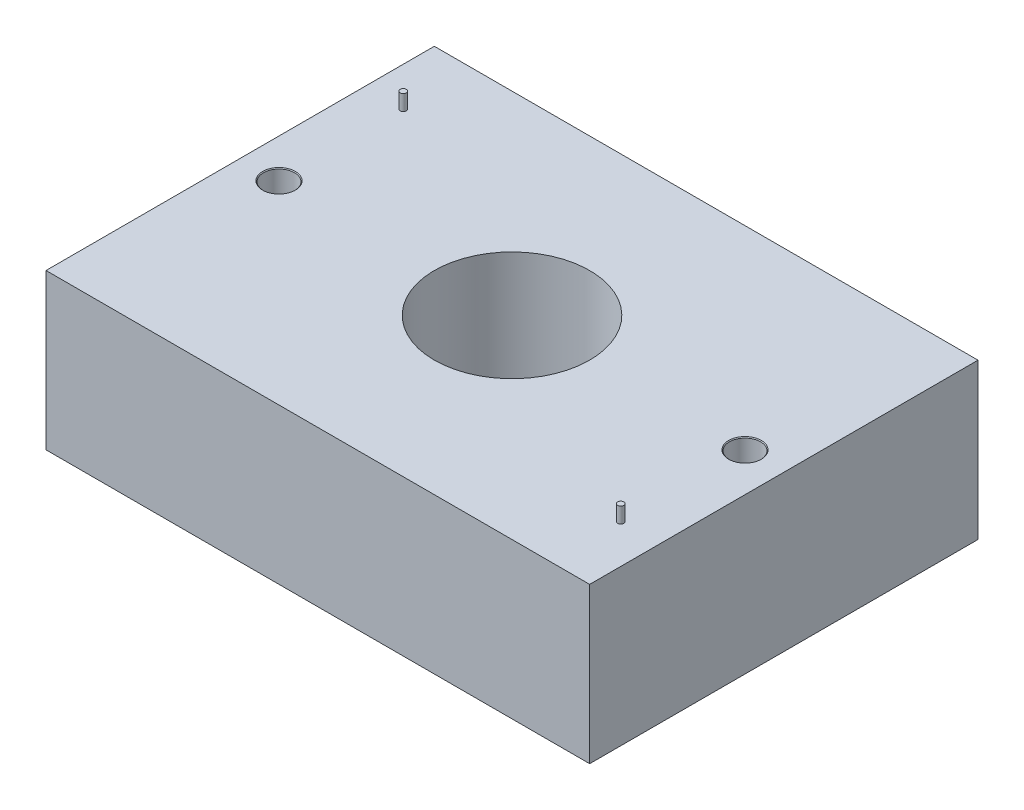
ISO-10303-21;
HEADER;
FILE_DESCRIPTION(('STEP AP214'),'2;1');
FILE_NAME('part.step','',(''),(''),'','','');
FILE_SCHEMA(('AUTOMOTIVE_DESIGN { 1 0 10303 214 1 1 1 1 }'));
ENDSEC;
DATA;
#1=APPLICATION_CONTEXT('core data for automotive mechanical design processes');
#2=APPLICATION_PROTOCOL_DEFINITION('international standard','automotive_design',2000,#1);
#3=PRODUCT_CONTEXT('',#1,'mechanical');
#4=PRODUCT('Part','Part','',(#3));
#5=PRODUCT_RELATED_PRODUCT_CATEGORY('part','',(#4));
#6=PRODUCT_DEFINITION_FORMATION('','',#4);
#7=PRODUCT_DEFINITION_CONTEXT('part definition',#1,'design');
#8=PRODUCT_DEFINITION('design','',#6,#7);
#9=PRODUCT_DEFINITION_SHAPE('','',#8);
#10=(LENGTH_UNIT() NAMED_UNIT(*) SI_UNIT(.MILLI.,.METRE.));
#11=(NAMED_UNIT(*) PLANE_ANGLE_UNIT() SI_UNIT($,.RADIAN.));
#12=(NAMED_UNIT(*) SI_UNIT($,.STERADIAN.) SOLID_ANGLE_UNIT());
#13=UNCERTAINTY_MEASURE_WITH_UNIT(LENGTH_MEASURE(1.E-05),#10,'distance_accuracy_value','');
#14=(GEOMETRIC_REPRESENTATION_CONTEXT(3) GLOBAL_UNCERTAINTY_ASSIGNED_CONTEXT((#13)) GLOBAL_UNIT_ASSIGNED_CONTEXT((#10,
#11,#12)) REPRESENTATION_CONTEXT('',''));
#15=CARTESIAN_POINT('',(0.,0.,0.));
#16=DIRECTION('',(0.,0.,1.));
#17=DIRECTION('',(1.,0.,0.));
#18=AXIS2_PLACEMENT_3D('',#15,#16,#17);
#19=CARTESIAN_POINT('',(0.,-50.,0.));
#20=DIRECTION('',(0.,0.,1.));
#21=DIRECTION('',(1.,0.,0.));
#22=AXIS2_PLACEMENT_3D('',#19,#20,#21);
#23=PLANE('',#22);
#24=DIRECTION('',(1.,0.,0.));
#25=VECTOR('',#24,1.);
#26=CARTESIAN_POINT('',(0.,0.,0.));
#27=LINE('',#26,#25);
#28=CARTESIAN_POINT('',(0.,0.,0.));
#29=VERTEX_POINT('',#28);
#30=CARTESIAN_POINT('',(175.,0.,0.));
#31=VERTEX_POINT('',#30);
#32=EDGE_CURVE('E190',#29,#31,#27,.T.);
#33=ORIENTED_EDGE('',*,*,#32,.F.);
#34=DIRECTION('',(0.,1.,0.));
#35=VECTOR('',#34,1.);
#36=CARTESIAN_POINT('',(0.,-50.,0.));
#37=LINE('',#36,#35);
#38=CARTESIAN_POINT('',(0.,-50.,0.));
#39=VERTEX_POINT('',#38);
#40=EDGE_CURVE('E13',#39,#29,#37,.T.);
#41=ORIENTED_EDGE('',*,*,#40,.F.);
#42=DIRECTION('',(1.,0.,0.));
#43=VECTOR('',#42,1.);
#44=CARTESIAN_POINT('',(0.,-50.,0.));
#45=LINE('',#44,#43);
#46=CARTESIAN_POINT('',(175.,-50.,0.));
#47=VERTEX_POINT('',#46);
#48=EDGE_CURVE('E204',#39,#47,#45,.T.);
#49=ORIENTED_EDGE('',*,*,#48,.T.);
#50=DIRECTION('',(0.,1.,0.));
#51=VECTOR('',#50,1.);
#52=CARTESIAN_POINT('',(175.,-50.,0.));
#53=LINE('',#52,#51);
#54=EDGE_CURVE('E69',#47,#31,#53,.T.);
#55=ORIENTED_EDGE('',*,*,#54,.T.);
#56=EDGE_LOOP('',(#33,#41,#49,#55));
#57=FACE_BOUND('',#56,.T.);
#58=ADVANCED_FACE('F65',(#57),#23,.T.);
#59=CARTESIAN_POINT('',(0.,-50.,0.));
#60=DIRECTION('',(1.,0.,0.));
#61=DIRECTION('',(0.,0.,-1.));
#62=AXIS2_PLACEMENT_3D('',#59,#60,#61);
#63=PLANE('',#62);
#64=DIRECTION('',(0.,0.,-1.));
#65=VECTOR('',#64,1.);
#66=CARTESIAN_POINT('',(0.,0.,0.));
#67=LINE('',#66,#65);
#68=CARTESIAN_POINT('',(0.,0.,-125.));
#69=VERTEX_POINT('',#68);
#70=EDGE_CURVE('E108',#29,#69,#67,.T.);
#71=ORIENTED_EDGE('',*,*,#70,.T.);
#72=DIRECTION('',(0.,1.,0.));
#73=VECTOR('',#72,1.);
#74=CARTESIAN_POINT('',(0.,-50.,-125.));
#75=LINE('',#74,#73);
#76=CARTESIAN_POINT('',(0.,-50.,-125.));
#77=VERTEX_POINT('',#76);
#78=EDGE_CURVE('E77',#77,#69,#75,.T.);
#79=ORIENTED_EDGE('',*,*,#78,.F.);
#80=DIRECTION('',(0.,0.,-1.));
#81=VECTOR('',#80,1.);
#82=CARTESIAN_POINT('',(0.,-50.,0.));
#83=LINE('',#82,#81);
#84=EDGE_CURVE('E183',#39,#77,#83,.T.);
#85=ORIENTED_EDGE('',*,*,#84,.F.);
#86=ORIENTED_EDGE('',*,*,#40,.T.);
#87=EDGE_LOOP('',(#71,#79,#85,#86));
#88=FACE_BOUND('',#87,.T.);
#89=ADVANCED_FACE('F310',(#88),#63,.F.);
#90=CARTESIAN_POINT('',(0.,-50.,-125.));
#91=DIRECTION('',(0.,0.,1.));
#92=DIRECTION('',(1.,0.,0.));
#93=AXIS2_PLACEMENT_3D('',#90,#91,#92);
#94=PLANE('',#93);
#95=DIRECTION('',(1.,0.,0.));
#96=VECTOR('',#95,1.);
#97=CARTESIAN_POINT('',(0.,0.,-125.));
#98=LINE('',#97,#96);
#99=CARTESIAN_POINT('',(175.,0.,-125.));
#100=VERTEX_POINT('',#99);
#101=EDGE_CURVE('E221',#69,#100,#98,.T.);
#102=ORIENTED_EDGE('',*,*,#101,.T.);
#103=DIRECTION('',(0.,1.,0.));
#104=VECTOR('',#103,1.);
#105=CARTESIAN_POINT('',(175.,-50.,-125.));
#106=LINE('',#105,#104);
#107=CARTESIAN_POINT('',(175.,-50.,-125.));
#108=VERTEX_POINT('',#107);
#109=EDGE_CURVE('E167',#108,#100,#106,.T.);
#110=ORIENTED_EDGE('',*,*,#109,.F.);
#111=DIRECTION('',(1.,0.,0.));
#112=VECTOR('',#111,1.);
#113=CARTESIAN_POINT('',(0.,-50.,-125.));
#114=LINE('',#113,#112);
#115=EDGE_CURVE('E180',#77,#108,#114,.T.);
#116=ORIENTED_EDGE('',*,*,#115,.F.);
#117=ORIENTED_EDGE('',*,*,#78,.T.);
#118=EDGE_LOOP('',(#102,#110,#116,#117));
#119=FACE_BOUND('',#118,.T.);
#120=ADVANCED_FACE('F309',(#119),#94,.F.);
#121=CARTESIAN_POINT('',(175.,-50.,0.));
#122=DIRECTION('',(1.,0.,0.));
#123=DIRECTION('',(0.,0.,-1.));
#124=AXIS2_PLACEMENT_3D('',#121,#122,#123);
#125=PLANE('',#124);
#126=DIRECTION('',(0.,0.,-1.));
#127=VECTOR('',#126,1.);
#128=CARTESIAN_POINT('',(175.,0.,0.));
#129=LINE('',#128,#127);
#130=EDGE_CURVE('E195',#31,#100,#129,.T.);
#131=ORIENTED_EDGE('',*,*,#130,.F.);
#132=ORIENTED_EDGE('',*,*,#54,.F.);
#133=DIRECTION('',(0.,0.,-1.));
#134=VECTOR('',#133,1.);
#135=CARTESIAN_POINT('',(175.,-50.,0.));
#136=LINE('',#135,#134);
#137=EDGE_CURVE('E184',#47,#108,#136,.T.);
#138=ORIENTED_EDGE('',*,*,#137,.T.);
#139=ORIENTED_EDGE('',*,*,#109,.T.);
#140=EDGE_LOOP('',(#131,#132,#138,#139));
#141=FACE_BOUND('',#140,.T.);
#142=ADVANCED_FACE('F305',(#141),#125,.T.);
#143=CARTESIAN_POINT('',(0.,-50.,0.));
#144=DIRECTION('',(0.,1.,0.));
#145=DIRECTION('',(0.,0.,1.));
#146=AXIS2_PLACEMENT_3D('',#143,#144,#145);
#147=PLANE('',#146);
#148=CARTESIAN_POINT('',(87.5,-50.,-62.5));
#149=DIRECTION('',(0.,1.,0.));
#150=DIRECTION('',(0.,0.,1.));
#151=AXIS2_PLACEMENT_3D('',#148,#149,#150);
#152=CIRCLE('',#151,25.);
#153=CARTESIAN_POINT('',(87.5,-50.,-37.5));
#154=VERTEX_POINT('',#153);
#155=EDGE_CURVE('E196',#154,#154,#152,.T.);
#156=ORIENTED_EDGE('',*,*,#155,.T.);
#157=EDGE_LOOP('',(#156));
#158=FACE_BOUND('',#157,.T.);
#159=ORIENTED_EDGE('',*,*,#48,.F.);
#160=ORIENTED_EDGE('',*,*,#84,.T.);
#161=ORIENTED_EDGE('',*,*,#115,.T.);
#162=ORIENTED_EDGE('',*,*,#137,.F.);
#163=EDGE_LOOP('',(#159,#160,#161,#162));
#164=FACE_BOUND('',#163,.T.);
#165=ADVANCED_FACE('F292',(#158,#164),#147,.F.);
#166=CARTESIAN_POINT('',(0.,0.,0.));
#167=DIRECTION('',(0.,1.,0.));
#168=DIRECTION('',(0.,0.,1.));
#169=AXIS2_PLACEMENT_3D('',#166,#167,#168);
#170=PLANE('',#169);
#171=CARTESIAN_POINT('',(12.5,0.,-62.5));
#172=DIRECTION('',(0.,1.,0.));
#173=DIRECTION('',(0.,0.,1.));
#174=AXIS2_PLACEMENT_3D('',#171,#172,#173);
#175=CIRCLE('',#174,5.25);
#176=CARTESIAN_POINT('',(12.5,0.,-57.25));
#177=VERTEX_POINT('',#176);
#178=EDGE_CURVE('E274',#177,#177,#175,.T.);
#179=ORIENTED_EDGE('',*,*,#178,.F.);
#180=EDGE_LOOP('',(#179));
#181=FACE_BOUND('',#180,.T.);
#182=CARTESIAN_POINT('',(162.5,0.,-62.5));
#183=DIRECTION('',(0.,1.,0.));
#184=DIRECTION('',(0.,0.,1.));
#185=AXIS2_PLACEMENT_3D('',#182,#183,#184);
#186=CIRCLE('',#185,5.25);
#187=CARTESIAN_POINT('',(162.5,0.,-57.25));
#188=VERTEX_POINT('',#187);
#189=EDGE_CURVE('E139',#188,#188,#186,.T.);
#190=ORIENTED_EDGE('',*,*,#189,.F.);
#191=EDGE_LOOP('',(#190));
#192=FACE_BOUND('',#191,.T.);
#193=CARTESIAN_POINT('',(162.5,0.,-22.5));
#194=DIRECTION('',(0.,1.,0.));
#195=DIRECTION('',(0.,0.,1.));
#196=AXIS2_PLACEMENT_3D('',#193,#194,#195);
#197=CIRCLE('',#196,0.999999999999998);
#198=CARTESIAN_POINT('',(162.5,0.,-21.5));
#199=VERTEX_POINT('',#198);
#200=EDGE_CURVE('E238',#199,#199,#197,.T.);
#201=ORIENTED_EDGE('',*,*,#200,.F.);
#202=EDGE_LOOP('',(#201));
#203=FACE_BOUND('',#202,.T.);
#204=CARTESIAN_POINT('',(12.5,0.,-102.5));
#205=DIRECTION('',(0.,1.,0.));
#206=DIRECTION('',(0.,0.,1.));
#207=AXIS2_PLACEMENT_3D('',#204,#205,#206);
#208=CIRCLE('',#207,1.);
#209=CARTESIAN_POINT('',(12.5,0.,-101.5));
#210=VERTEX_POINT('',#209);
#211=EDGE_CURVE('E235',#210,#210,#208,.T.);
#212=ORIENTED_EDGE('',*,*,#211,.F.);
#213=EDGE_LOOP('',(#212));
#214=FACE_BOUND('',#213,.T.);
#215=CARTESIAN_POINT('',(87.5,0.,-62.5));
#216=DIRECTION('',(0.,1.,0.));
#217=DIRECTION('',(0.,0.,1.));
#218=AXIS2_PLACEMENT_3D('',#215,#216,#217);
#219=CIRCLE('',#218,25.);
#220=CARTESIAN_POINT('',(87.5,0.,-37.5));
#221=VERTEX_POINT('',#220);
#222=EDGE_CURVE('E208',#221,#221,#219,.T.);
#223=ORIENTED_EDGE('',*,*,#222,.F.);
#224=EDGE_LOOP('',(#223));
#225=FACE_BOUND('',#224,.T.);
#226=ORIENTED_EDGE('',*,*,#32,.T.);
#227=ORIENTED_EDGE('',*,*,#130,.T.);
#228=ORIENTED_EDGE('',*,*,#101,.F.);
#229=ORIENTED_EDGE('',*,*,#70,.F.);
#230=EDGE_LOOP('',(#226,#227,#228,#229));
#231=FACE_BOUND('',#230,.T.);
#232=ADVANCED_FACE('F288',(#181,#192,#203,#214,#225,#231),#170,.T.);
#233=CARTESIAN_POINT('',(87.5,-50.,-62.5));
#234=DIRECTION('',(0.,1.,0.));
#235=DIRECTION('',(0.,0.,1.));
#236=AXIS2_PLACEMENT_3D('',#233,#234,#235);
#237=CYLINDRICAL_SURFACE('',#236,25.);
#238=ORIENTED_EDGE('',*,*,#155,.F.);
#239=EDGE_LOOP('',(#238));
#240=FACE_BOUND('',#239,.T.);
#241=ORIENTED_EDGE('',*,*,#222,.T.);
#242=EDGE_LOOP('',(#241));
#243=FACE_BOUND('',#242,.T.);
#244=ADVANCED_FACE('F291',(#240,#243),#237,.F.);
#245=CARTESIAN_POINT('',(12.5,5.,-102.5));
#246=DIRECTION('',(0.,-1.,0.));
#247=DIRECTION('',(0.,0.,-1.));
#248=AXIS2_PLACEMENT_3D('',#245,#246,#247);
#249=CYLINDRICAL_SURFACE('',#248,1.);
#250=CARTESIAN_POINT('',(12.5,5.,-102.5));
#251=DIRECTION('',(0.,1.,0.));
#252=DIRECTION('',(0.,0.,1.));
#253=AXIS2_PLACEMENT_3D('',#250,#251,#252);
#254=CIRCLE('',#253,1.);
#255=CARTESIAN_POINT('',(12.5,5.,-101.5));
#256=VERTEX_POINT('',#255);
#257=EDGE_CURVE('E213',#256,#256,#254,.T.);
#258=ORIENTED_EDGE('',*,*,#257,.F.);
#259=EDGE_LOOP('',(#258));
#260=FACE_BOUND('',#259,.T.);
#261=ORIENTED_EDGE('',*,*,#211,.T.);
#262=EDGE_LOOP('',(#261));
#263=FACE_BOUND('',#262,.T.);
#264=ADVANCED_FACE('F378',(#260,#263),#249,.T.);
#265=CARTESIAN_POINT('',(0.,5.,0.));
#266=DIRECTION('',(0.,1.,0.));
#267=DIRECTION('',(0.,0.,1.));
#268=AXIS2_PLACEMENT_3D('',#265,#266,#267);
#269=PLANE('',#268);
#270=ORIENTED_EDGE('',*,*,#257,.T.);
#271=EDGE_LOOP('',(#270));
#272=FACE_BOUND('',#271,.T.);
#273=ADVANCED_FACE('F370',(#272),#269,.T.);
#274=CARTESIAN_POINT('',(162.5,5.,-22.5));
#275=DIRECTION('',(0.,-1.,0.));
#276=DIRECTION('',(0.,0.,-1.));
#277=AXIS2_PLACEMENT_3D('',#274,#275,#276);
#278=CYLINDRICAL_SURFACE('',#277,0.999999999999998);
#279=CARTESIAN_POINT('',(162.5,5.,-22.5));
#280=DIRECTION('',(0.,1.,0.));
#281=DIRECTION('',(0.,0.,1.));
#282=AXIS2_PLACEMENT_3D('',#279,#280,#281);
#283=CIRCLE('',#282,0.999999999999998);
#284=CARTESIAN_POINT('',(162.5,5.,-21.5));
#285=VERTEX_POINT('',#284);
#286=EDGE_CURVE('E241',#285,#285,#283,.T.);
#287=ORIENTED_EDGE('',*,*,#286,.F.);
#288=EDGE_LOOP('',(#287));
#289=FACE_BOUND('',#288,.T.);
#290=ORIENTED_EDGE('',*,*,#200,.T.);
#291=EDGE_LOOP('',(#290));
#292=FACE_BOUND('',#291,.T.);
#293=ADVANCED_FACE('F367',(#289,#292),#278,.T.);
#294=CARTESIAN_POINT('',(162.5,5.,-22.5));
#295=DIRECTION('',(0.,1.,0.));
#296=DIRECTION('',(0.,0.,1.));
#297=AXIS2_PLACEMENT_3D('',#294,#295,#296);
#298=PLANE('',#297);
#299=ORIENTED_EDGE('',*,*,#286,.T.);
#300=EDGE_LOOP('',(#299));
#301=FACE_BOUND('',#300,.T.);
#302=ADVANCED_FACE('F365',(#301),#298,.T.);
#303=CARTESIAN_POINT('',(162.5,-25.4463423691329,-62.5));
#304=DIRECTION('',(0.,1.,0.));
#305=DIRECTION('',(0.,0.,1.));
#306=AXIS2_PLACEMENT_3D('',#303,#304,#305);
#307=CONICAL_SURFACE('',#306,4.25,1.02974425867666);
#308=CARTESIAN_POINT('',(162.5,-28.,-62.5));
#309=VERTEX_POINT('',#308);
#310=VERTEX_LOOP('',#309);
#311=FACE_BOUND('',#310,.T.);
#312=CARTESIAN_POINT('',(162.5,-25.4463423691329,-62.5));
#313=DIRECTION('',(0.,1.,0.));
#314=DIRECTION('',(0.,0.,1.));
#315=AXIS2_PLACEMENT_3D('',#312,#313,#314);
#316=CIRCLE('',#315,4.25);
#317=CARTESIAN_POINT('',(162.5,-25.4463423691329,-58.25));
#318=VERTEX_POINT('',#317);
#319=EDGE_CURVE('E245',#318,#318,#316,.T.);
#320=ORIENTED_EDGE('',*,*,#319,.T.);
#321=EDGE_LOOP('',(#320));
#322=FACE_BOUND('',#321,.T.);
#323=ADVANCED_FACE('F359',(#311,#322),#307,.F.);
#324=CARTESIAN_POINT('',(162.5,0.,-62.5));
#325=DIRECTION('',(0.,1.,0.));
#326=DIRECTION('',(0.,0.,1.));
#327=AXIS2_PLACEMENT_3D('',#324,#325,#326);
#328=CYLINDRICAL_SURFACE('',#327,4.25);
#329=ORIENTED_EDGE('',*,*,#319,.F.);
#330=EDGE_LOOP('',(#329));
#331=FACE_BOUND('',#330,.T.);
#332=CARTESIAN_POINT('',(162.5,-20.,-62.5));
#333=DIRECTION('',(0.,1.,0.));
#334=DIRECTION('',(0.,0.,1.));
#335=AXIS2_PLACEMENT_3D('',#332,#333,#334);
#336=CIRCLE('',#335,4.25);
#337=CARTESIAN_POINT('',(162.5,-20.,-58.25));
#338=VERTEX_POINT('',#337);
#339=EDGE_CURVE('E248',#338,#338,#336,.T.);
#340=ORIENTED_EDGE('',*,*,#339,.T.);
#341=EDGE_LOOP('',(#340));
#342=FACE_BOUND('',#341,.T.);
#343=ADVANCED_FACE('F355',(#331,#342),#328,.F.);
#344=CARTESIAN_POINT('',(166.75,-20.,-62.5));
#345=DIRECTION('',(0.,-1.,0.));
#346=DIRECTION('',(0.,0.,-1.));
#347=AXIS2_PLACEMENT_3D('',#344,#345,#346);
#348=PLANE('',#347);
#349=ORIENTED_EDGE('',*,*,#339,.F.);
#350=EDGE_LOOP('',(#349));
#351=FACE_BOUND('',#350,.T.);
#352=CARTESIAN_POINT('',(162.5,-20.,-62.5));
#353=DIRECTION('',(0.,1.,0.));
#354=DIRECTION('',(0.,0.,1.));
#355=AXIS2_PLACEMENT_3D('',#352,#353,#354);
#356=CIRCLE('',#355,5.);
#357=CARTESIAN_POINT('',(162.5,-20.,-57.5));
#358=VERTEX_POINT('',#357);
#359=EDGE_CURVE('E252',#358,#358,#356,.T.);
#360=ORIENTED_EDGE('',*,*,#359,.T.);
#361=EDGE_LOOP('',(#360));
#362=FACE_BOUND('',#361,.T.);
#363=ADVANCED_FACE('F348',(#351,#362),#348,.F.);
#364=CARTESIAN_POINT('',(162.5,0.,-62.5));
#365=DIRECTION('',(0.,1.,0.));
#366=DIRECTION('',(0.,0.,1.));
#367=AXIS2_PLACEMENT_3D('',#364,#365,#366);
#368=CYLINDRICAL_SURFACE('',#367,5.);
#369=ORIENTED_EDGE('',*,*,#359,.F.);
#370=EDGE_LOOP('',(#369));
#371=FACE_BOUND('',#370,.T.);
#372=CARTESIAN_POINT('',(162.5,-0.250000000000003,-62.5));
#373=DIRECTION('',(0.,1.,0.));
#374=DIRECTION('',(0.,0.,1.));
#375=AXIS2_PLACEMENT_3D('',#372,#373,#374);
#376=CIRCLE('',#375,5.);
#377=CARTESIAN_POINT('',(162.5,-0.250000000000003,-57.5));
#378=VERTEX_POINT('',#377);
#379=EDGE_CURVE('E145',#378,#378,#376,.T.);
#380=ORIENTED_EDGE('',*,*,#379,.T.);
#381=EDGE_LOOP('',(#380));
#382=FACE_BOUND('',#381,.T.);
#383=ADVANCED_FACE('F339',(#371,#382),#368,.F.);
#384=CARTESIAN_POINT('',(162.5,0.,-62.5));
#385=DIRECTION('',(0.,1.,0.));
#386=DIRECTION('',(0.,0.,1.));
#387=AXIS2_PLACEMENT_3D('',#384,#385,#386);
#388=CONICAL_SURFACE('',#387,5.25,0.785398163397442);
#389=ORIENTED_EDGE('',*,*,#379,.F.);
#390=EDGE_LOOP('',(#389));
#391=FACE_BOUND('',#390,.T.);
#392=ORIENTED_EDGE('',*,*,#189,.T.);
#393=EDGE_LOOP('',(#392));
#394=FACE_BOUND('',#393,.T.);
#395=ADVANCED_FACE('F132',(#391,#394),#388,.F.);
#396=CARTESIAN_POINT('',(12.5,-25.4463423691329,-62.5));
#397=DIRECTION('',(0.,1.,0.));
#398=DIRECTION('',(0.,0.,1.));
#399=AXIS2_PLACEMENT_3D('',#396,#397,#398);
#400=CONICAL_SURFACE('',#399,4.24999999999999,1.02974425867665);
#401=CARTESIAN_POINT('',(12.5,-28.,-62.5));
#402=VERTEX_POINT('',#401);
#403=VERTEX_LOOP('',#402);
#404=FACE_BOUND('',#403,.T.);
#405=CARTESIAN_POINT('',(12.5,-25.4463423691329,-62.5));
#406=DIRECTION('',(0.,1.,0.));
#407=DIRECTION('',(0.,0.,1.));
#408=AXIS2_PLACEMENT_3D('',#405,#406,#407);
#409=CIRCLE('',#408,4.24999999999999);
#410=CARTESIAN_POINT('',(12.5,-25.4463423691329,-58.25));
#411=VERTEX_POINT('',#410);
#412=EDGE_CURVE('E136',#411,#411,#409,.T.);
#413=ORIENTED_EDGE('',*,*,#412,.T.);
#414=EDGE_LOOP('',(#413));
#415=FACE_BOUND('',#414,.T.);
#416=ADVANCED_FACE('F128',(#404,#415),#400,.F.);
#417=CARTESIAN_POINT('',(12.5,0.,-62.5));
#418=DIRECTION('',(0.,1.,0.));
#419=DIRECTION('',(0.,0.,1.));
#420=AXIS2_PLACEMENT_3D('',#417,#418,#419);
#421=CYLINDRICAL_SURFACE('',#420,4.24999999999999);
#422=ORIENTED_EDGE('',*,*,#412,.F.);
#423=EDGE_LOOP('',(#422));
#424=FACE_BOUND('',#423,.T.);
#425=CARTESIAN_POINT('',(12.5,-20.,-62.5));
#426=DIRECTION('',(0.,1.,0.));
#427=DIRECTION('',(0.,0.,1.));
#428=AXIS2_PLACEMENT_3D('',#425,#426,#427);
#429=CIRCLE('',#428,4.24999999999999);
#430=CARTESIAN_POINT('',(12.5,-20.,-58.25));
#431=VERTEX_POINT('',#430);
#432=EDGE_CURVE('E140',#431,#431,#429,.T.);
#433=ORIENTED_EDGE('',*,*,#432,.T.);
#434=EDGE_LOOP('',(#433));
#435=FACE_BOUND('',#434,.T.);
#436=ADVANCED_FACE('F131',(#424,#435),#421,.F.);
#437=CARTESIAN_POINT('',(16.75,-20.,-62.5));
#438=DIRECTION('',(0.,-1.,0.));
#439=DIRECTION('',(0.,0.,-1.));
#440=AXIS2_PLACEMENT_3D('',#437,#438,#439);
#441=PLANE('',#440);
#442=ORIENTED_EDGE('',*,*,#432,.F.);
#443=EDGE_LOOP('',(#442));
#444=FACE_BOUND('',#443,.T.);
#445=CARTESIAN_POINT('',(12.5,-20.,-62.5));
#446=DIRECTION('',(0.,1.,0.));
#447=DIRECTION('',(0.,0.,1.));
#448=AXIS2_PLACEMENT_3D('',#445,#446,#447);
#449=CIRCLE('',#448,5.);
#450=CARTESIAN_POINT('',(12.5,-20.,-57.5));
#451=VERTEX_POINT('',#450);
#452=EDGE_CURVE('E148',#451,#451,#449,.T.);
#453=ORIENTED_EDGE('',*,*,#452,.T.);
#454=EDGE_LOOP('',(#453));
#455=FACE_BOUND('',#454,.T.);
#456=ADVANCED_FACE('F425',(#444,#455),#441,.F.);
#457=CARTESIAN_POINT('',(12.5,0.,-62.5));
#458=DIRECTION('',(0.,1.,0.));
#459=DIRECTION('',(0.,0.,1.));
#460=AXIS2_PLACEMENT_3D('',#457,#458,#459);
#461=CYLINDRICAL_SURFACE('',#460,5.);
#462=ORIENTED_EDGE('',*,*,#452,.F.);
#463=EDGE_LOOP('',(#462));
#464=FACE_BOUND('',#463,.T.);
#465=CARTESIAN_POINT('',(12.5,-0.250000000000003,-62.5));
#466=DIRECTION('',(0.,1.,0.));
#467=DIRECTION('',(0.,0.,1.));
#468=AXIS2_PLACEMENT_3D('',#465,#466,#467);
#469=CIRCLE('',#468,4.99999999999999);
#470=CARTESIAN_POINT('',(12.5,-0.250000000000003,-57.5));
#471=VERTEX_POINT('',#470);
#472=EDGE_CURVE('E269',#471,#471,#469,.T.);
#473=ORIENTED_EDGE('',*,*,#472,.T.);
#474=EDGE_LOOP('',(#473));
#475=FACE_BOUND('',#474,.T.);
#476=ADVANCED_FACE('F430',(#464,#475),#461,.F.);
#477=CARTESIAN_POINT('',(12.5,0.,-62.5));
#478=DIRECTION('',(0.,1.,0.));
#479=DIRECTION('',(0.,0.,1.));
#480=AXIS2_PLACEMENT_3D('',#477,#478,#479);
#481=CONICAL_SURFACE('',#480,5.25,0.785398163397455);
#482=ORIENTED_EDGE('',*,*,#472,.F.);
#483=EDGE_LOOP('',(#482));
#484=FACE_BOUND('',#483,.T.);
#485=ORIENTED_EDGE('',*,*,#178,.T.);
#486=EDGE_LOOP('',(#485));
#487=FACE_BOUND('',#486,.T.);
#488=ADVANCED_FACE('F286',(#484,#487),#481,.F.);
#489=CLOSED_SHELL('',(#58,#89,#120,#142,#165,#232,#244,#264,#273,#293,#302,#323,#343,#363,#383,
#395,#416,#436,#456,#476,#488));
#490=MANIFOLD_SOLID_BREP('B2',#489);
#491=ADVANCED_BREP_SHAPE_REPRESENTATION('',(#18,#490),#14);
#492=SHAPE_DEFINITION_REPRESENTATION(#9,#491);
ENDSEC;
END-ISO-10303-21;
